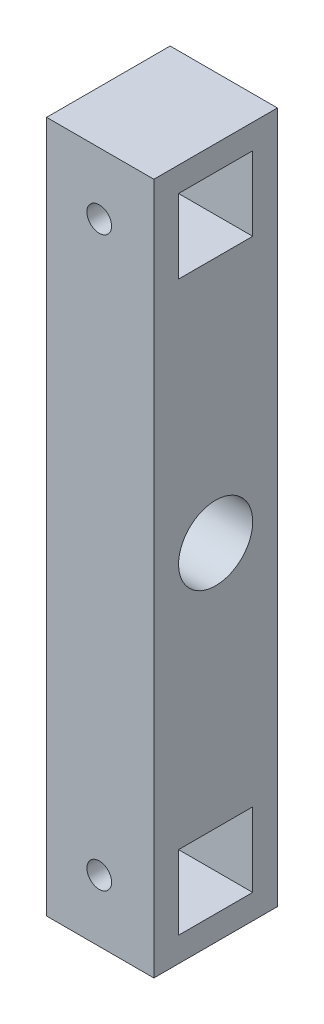
ISO-10303-21;
HEADER;
FILE_DESCRIPTION(('STEP AP214'),'2;1');
FILE_NAME('part.step','',(''),(''),'','','');
FILE_SCHEMA(('AUTOMOTIVE_DESIGN { 1 0 10303 214 1 1 1 1 }'));
ENDSEC;
DATA;
#1=APPLICATION_CONTEXT('core data for automotive mechanical design processes');
#2=APPLICATION_PROTOCOL_DEFINITION('international standard','automotive_design',2000,#1);
#3=PRODUCT_CONTEXT('',#1,'mechanical');
#4=PRODUCT('Part','Part','',(#3));
#5=PRODUCT_RELATED_PRODUCT_CATEGORY('part','',(#4));
#6=PRODUCT_DEFINITION_FORMATION('','',#4);
#7=PRODUCT_DEFINITION_CONTEXT('part definition',#1,'design');
#8=PRODUCT_DEFINITION('design','',#6,#7);
#9=PRODUCT_DEFINITION_SHAPE('','',#8);
#10=(LENGTH_UNIT() NAMED_UNIT(*) SI_UNIT(.MILLI.,.METRE.));
#11=(NAMED_UNIT(*) PLANE_ANGLE_UNIT() SI_UNIT($,.RADIAN.));
#12=(NAMED_UNIT(*) SI_UNIT($,.STERADIAN.) SOLID_ANGLE_UNIT());
#13=UNCERTAINTY_MEASURE_WITH_UNIT(LENGTH_MEASURE(1.E-05),#10,'distance_accuracy_value','');
#14=(GEOMETRIC_REPRESENTATION_CONTEXT(3) GLOBAL_UNCERTAINTY_ASSIGNED_CONTEXT((#13)) GLOBAL_UNIT_ASSIGNED_CONTEXT((#10,
#11,#12)) REPRESENTATION_CONTEXT('',''));
#15=CARTESIAN_POINT('',(0.,0.,0.));
#16=DIRECTION('',(0.,0.,1.));
#17=DIRECTION('',(1.,0.,0.));
#18=AXIS2_PLACEMENT_3D('',#15,#16,#17);
#19=CARTESIAN_POINT('',(208.703134794514,0.,50.));
#20=DIRECTION('',(-1.,0.,0.));
#21=DIRECTION('',(0.,0.,1.));
#22=AXIS2_PLACEMENT_3D('',#19,#20,#21);
#23=PLANE('',#22);
#24=CARTESIAN_POINT('',(208.703134794514,-115.,25.));
#25=DIRECTION('',(-1.,0.,0.));
#26=DIRECTION('',(0.,0.,1.));
#27=AXIS2_PLACEMENT_3D('',#24,#25,#26);
#28=CIRCLE('',#27,15.);
#29=CARTESIAN_POINT('',(208.703134794514,-115.,40.));
#30=VERTEX_POINT('',#29);
#31=EDGE_CURVE('E315',#30,#30,#28,.T.);
#32=ORIENTED_EDGE('',*,*,#31,.F.);
#33=EDGE_LOOP('',(#32));
#34=FACE_BOUND('',#33,.T.);
#35=DIRECTION('',(0.,0.,1.));
#36=VECTOR('',#35,1.);
#37=CARTESIAN_POINT('',(208.703134794514,-15.,50.));
#38=LINE('',#37,#36);
#39=CARTESIAN_POINT('',(208.703134794514,-15.,10.));
#40=VERTEX_POINT('',#39);
#41=CARTESIAN_POINT('',(208.703134794514,-15.,40.));
#42=VERTEX_POINT('',#41);
#43=EDGE_CURVE('E196',#40,#42,#38,.T.);
#44=ORIENTED_EDGE('',*,*,#43,.F.);
#45=DIRECTION('',(0.,1.,0.));
#46=VECTOR('',#45,1.);
#47=CARTESIAN_POINT('',(208.703134794514,0.,10.));
#48=LINE('',#47,#46);
#49=CARTESIAN_POINT('',(208.703134794514,15.,10.));
#50=VERTEX_POINT('',#49);
#51=EDGE_CURVE('E190',#40,#50,#48,.T.);
#52=ORIENTED_EDGE('',*,*,#51,.T.);
#53=DIRECTION('',(0.,0.,1.));
#54=VECTOR('',#53,1.);
#55=CARTESIAN_POINT('',(208.703134794514,15.,50.));
#56=LINE('',#55,#54);
#57=CARTESIAN_POINT('',(208.703134794514,15.,40.));
#58=VERTEX_POINT('',#57);
#59=EDGE_CURVE('E193',#50,#58,#56,.T.);
#60=ORIENTED_EDGE('',*,*,#59,.T.);
#61=DIRECTION('',(0.,1.,0.));
#62=VECTOR('',#61,1.);
#63=CARTESIAN_POINT('',(208.703134794514,0.,40.));
#64=LINE('',#63,#62);
#65=EDGE_CURVE('E186',#42,#58,#64,.T.);
#66=ORIENTED_EDGE('',*,*,#65,.F.);
#67=EDGE_LOOP('',(#44,#52,#60,#66));
#68=FACE_BOUND('',#67,.T.);
#69=DIRECTION('',(0.,1.,0.));
#70=VECTOR('',#69,1.);
#71=CARTESIAN_POINT('',(208.703134794514,0.,0.));
#72=LINE('',#71,#70);
#73=CARTESIAN_POINT('',(208.703134794514,-255.,0.));
#74=VERTEX_POINT('',#73);
#75=CARTESIAN_POINT('',(208.703134794514,25.,0.));
#76=VERTEX_POINT('',#75);
#77=EDGE_CURVE('E227',#74,#76,#72,.T.);
#78=ORIENTED_EDGE('',*,*,#77,.F.);
#79=DIRECTION('',(0.,0.,-1.));
#80=VECTOR('',#79,1.);
#81=CARTESIAN_POINT('',(208.703134794514,-255.,50.));
#82=LINE('',#81,#80);
#83=CARTESIAN_POINT('',(208.703134794514,-255.,50.));
#84=VERTEX_POINT('',#83);
#85=EDGE_CURVE('E45',#84,#74,#82,.T.);
#86=ORIENTED_EDGE('',*,*,#85,.F.);
#87=DIRECTION('',(0.,1.,0.));
#88=VECTOR('',#87,1.);
#89=CARTESIAN_POINT('',(208.703134794514,0.,50.));
#90=LINE('',#89,#88);
#91=CARTESIAN_POINT('',(208.703134794514,25.,50.));
#92=VERTEX_POINT('',#91);
#93=EDGE_CURVE('E214',#84,#92,#90,.T.);
#94=ORIENTED_EDGE('',*,*,#93,.T.);
#95=DIRECTION('',(0.,0.,-1.));
#96=VECTOR('',#95,1.);
#97=CARTESIAN_POINT('',(208.703134794514,25.,50.));
#98=LINE('',#97,#96);
#99=EDGE_CURVE('E11',#92,#76,#98,.T.);
#100=ORIENTED_EDGE('',*,*,#99,.T.);
#101=EDGE_LOOP('',(#78,#86,#94,#100));
#102=FACE_BOUND('',#101,.T.);
#103=DIRECTION('',(0.,0.,1.));
#104=VECTOR('',#103,1.);
#105=CARTESIAN_POINT('',(208.703134794514,-215.,50.));
#106=LINE('',#105,#104);
#107=CARTESIAN_POINT('',(208.703134794514,-215.,10.));
#108=VERTEX_POINT('',#107);
#109=CARTESIAN_POINT('',(208.703134794514,-215.,40.));
#110=VERTEX_POINT('',#109);
#111=EDGE_CURVE('E161',#108,#110,#106,.T.);
#112=ORIENTED_EDGE('',*,*,#111,.T.);
#113=DIRECTION('',(0.,-1.,0.));
#114=VECTOR('',#113,1.);
#115=CARTESIAN_POINT('',(208.703134794514,0.,39.9999999999999));
#116=LINE('',#115,#114);
#117=CARTESIAN_POINT('',(208.703134794514,-245.,40.));
#118=VERTEX_POINT('',#117);
#119=EDGE_CURVE('E156',#110,#118,#116,.T.);
#120=ORIENTED_EDGE('',*,*,#119,.T.);
#121=DIRECTION('',(0.,0.,1.));
#122=VECTOR('',#121,1.);
#123=CARTESIAN_POINT('',(208.703134794514,-245.,50.));
#124=LINE('',#123,#122);
#125=CARTESIAN_POINT('',(208.703134794514,-245.,10.));
#126=VERTEX_POINT('',#125);
#127=EDGE_CURVE('E159',#126,#118,#124,.T.);
#128=ORIENTED_EDGE('',*,*,#127,.F.);
#129=DIRECTION('',(0.,-1.,0.));
#130=VECTOR('',#129,1.);
#131=CARTESIAN_POINT('',(208.703134794514,0.,9.99999999999997));
#132=LINE('',#131,#130);
#133=EDGE_CURVE('E133',#108,#126,#132,.T.);
#134=ORIENTED_EDGE('',*,*,#133,.F.);
#135=EDGE_LOOP('',(#112,#120,#128,#134));
#136=FACE_BOUND('',#135,.T.);
#137=ADVANCED_FACE('F36',(#34,#68,#102,#136),#23,.T.);
#138=CARTESIAN_POINT('',(252.115995137388,0.,50.));
#139=DIRECTION('',(1.,0.,0.));
#140=DIRECTION('',(0.,1.,0.));
#141=AXIS2_PLACEMENT_3D('',#138,#139,#140);
#142=PLANE('',#141);
#143=CARTESIAN_POINT('',(252.115995137388,-115.,25.));
#144=DIRECTION('',(1.,0.,0.));
#145=DIRECTION('',(0.,1.,0.));
#146=AXIS2_PLACEMENT_3D('',#143,#144,#145);
#147=CIRCLE('',#146,15.);
#148=CARTESIAN_POINT('',(252.115995137388,-100.,25.));
#149=VERTEX_POINT('',#148);
#150=EDGE_CURVE('E318',#149,#149,#147,.T.);
#151=ORIENTED_EDGE('',*,*,#150,.F.);
#152=EDGE_LOOP('',(#151));
#153=FACE_BOUND('',#152,.T.);
#154=DIRECTION('',(0.,0.,-1.));
#155=VECTOR('',#154,1.);
#156=CARTESIAN_POINT('',(252.115995137388,15.,0.));
#157=LINE('',#156,#155);
#158=CARTESIAN_POINT('',(252.115995137388,15.,40.));
#159=VERTEX_POINT('',#158);
#160=CARTESIAN_POINT('',(252.115995137388,15.,10.));
#161=VERTEX_POINT('',#160);
#162=EDGE_CURVE('E167',#159,#161,#157,.T.);
#163=ORIENTED_EDGE('',*,*,#162,.T.);
#164=DIRECTION('',(0.,-1.,0.));
#165=VECTOR('',#164,1.);
#166=CARTESIAN_POINT('',(252.115995137388,0.,10.));
#167=LINE('',#166,#165);
#168=CARTESIAN_POINT('',(252.115995137388,-15.,10.));
#169=VERTEX_POINT('',#168);
#170=EDGE_CURVE('E164',#161,#169,#167,.T.);
#171=ORIENTED_EDGE('',*,*,#170,.T.);
#172=DIRECTION('',(0.,0.,-1.));
#173=VECTOR('',#172,1.);
#174=CARTESIAN_POINT('',(252.115995137388,-15.,0.));
#175=LINE('',#174,#173);
#176=CARTESIAN_POINT('',(252.115995137388,-15.,40.));
#177=VERTEX_POINT('',#176);
#178=EDGE_CURVE('E173',#177,#169,#175,.T.);
#179=ORIENTED_EDGE('',*,*,#178,.F.);
#180=DIRECTION('',(0.,-1.,0.));
#181=VECTOR('',#180,1.);
#182=CARTESIAN_POINT('',(252.115995137388,0.,40.));
#183=LINE('',#182,#181);
#184=EDGE_CURVE('E170',#159,#177,#183,.T.);
#185=ORIENTED_EDGE('',*,*,#184,.F.);
#186=EDGE_LOOP('',(#163,#171,#179,#185));
#187=FACE_BOUND('',#186,.T.);
#188=DIRECTION('',(0.,-1.,0.));
#189=VECTOR('',#188,1.);
#190=CARTESIAN_POINT('',(252.115995137388,0.,0.));
#191=LINE('',#190,#189);
#192=CARTESIAN_POINT('',(252.115995137388,25.,0.));
#193=VERTEX_POINT('',#192);
#194=CARTESIAN_POINT('',(252.115995137389,-255.,0.));
#195=VERTEX_POINT('',#194);
#196=EDGE_CURVE('E215',#193,#195,#191,.T.);
#197=ORIENTED_EDGE('',*,*,#196,.F.);
#198=DIRECTION('',(0.,0.,-1.));
#199=VECTOR('',#198,1.);
#200=CARTESIAN_POINT('',(252.115995137388,25.,50.));
#201=LINE('',#200,#199);
#202=CARTESIAN_POINT('',(252.115995137388,25.,50.));
#203=VERTEX_POINT('',#202);
#204=EDGE_CURVE('E224',#203,#193,#201,.T.);
#205=ORIENTED_EDGE('',*,*,#204,.F.);
#206=DIRECTION('',(0.,-1.,0.));
#207=VECTOR('',#206,1.);
#208=CARTESIAN_POINT('',(252.115995137388,0.,50.));
#209=LINE('',#208,#207);
#210=CARTESIAN_POINT('',(252.115995137389,-255.,50.));
#211=VERTEX_POINT('',#210);
#212=EDGE_CURVE('E221',#203,#211,#209,.T.);
#213=ORIENTED_EDGE('',*,*,#212,.T.);
#214=DIRECTION('',(0.,0.,-1.));
#215=VECTOR('',#214,1.);
#216=CARTESIAN_POINT('',(252.115995137389,-255.,50.));
#217=LINE('',#216,#215);
#218=EDGE_CURVE('E236',#211,#195,#217,.T.);
#219=ORIENTED_EDGE('',*,*,#218,.T.);
#220=EDGE_LOOP('',(#197,#205,#213,#219));
#221=FACE_BOUND('',#220,.T.);
#222=DIRECTION('',(0.,0.,-1.));
#223=VECTOR('',#222,1.);
#224=CARTESIAN_POINT('',(252.115995137388,-245.,0.));
#225=LINE('',#224,#223);
#226=CARTESIAN_POINT('',(252.115995137389,-245.,40.));
#227=VERTEX_POINT('',#226);
#228=CARTESIAN_POINT('',(252.115995137388,-245.,10.));
#229=VERTEX_POINT('',#228);
#230=EDGE_CURVE('E139',#227,#229,#225,.T.);
#231=ORIENTED_EDGE('',*,*,#230,.F.);
#232=DIRECTION('',(0.,1.,0.));
#233=VECTOR('',#232,1.);
#234=CARTESIAN_POINT('',(252.115995137388,0.,39.9999999999999));
#235=LINE('',#234,#233);
#236=CARTESIAN_POINT('',(252.115995137388,-215.,40.));
#237=VERTEX_POINT('',#236);
#238=EDGE_CURVE('E61',#227,#237,#235,.T.);
#239=ORIENTED_EDGE('',*,*,#238,.T.);
#240=DIRECTION('',(0.,0.,-1.));
#241=VECTOR('',#240,1.);
#242=CARTESIAN_POINT('',(252.115995137388,-215.,0.));
#243=LINE('',#242,#241);
#244=CARTESIAN_POINT('',(252.115995137388,-215.,10.));
#245=VERTEX_POINT('',#244);
#246=EDGE_CURVE('E145',#237,#245,#243,.T.);
#247=ORIENTED_EDGE('',*,*,#246,.T.);
#248=DIRECTION('',(0.,1.,0.));
#249=VECTOR('',#248,1.);
#250=CARTESIAN_POINT('',(252.115995137388,0.,9.99999999999997));
#251=LINE('',#250,#249);
#252=EDGE_CURVE('E130',#229,#245,#251,.T.);
#253=ORIENTED_EDGE('',*,*,#252,.F.);
#254=EDGE_LOOP('',(#231,#239,#247,#253));
#255=FACE_BOUND('',#254,.T.);
#256=ADVANCED_FACE('F143',(#153,#187,#221,#255),#142,.T.);
#257=CARTESIAN_POINT('',(230.,-230.,0.));
#258=DIRECTION('',(0.,0.,1.));
#259=DIRECTION('',(1.,0.,0.));
#260=AXIS2_PLACEMENT_3D('',#257,#258,#259);
#261=CYLINDRICAL_SURFACE('',#260,5.00000000000002);
#262=CARTESIAN_POINT('',(230.,-230.,50.));
#263=DIRECTION('',(0.,0.,1.));
#264=DIRECTION('',(1.,0.,0.));
#265=AXIS2_PLACEMENT_3D('',#262,#263,#264);
#266=CIRCLE('',#265,5.00000000000002);
#267=CARTESIAN_POINT('',(235.,-230.,50.));
#268=VERTEX_POINT('',#267);
#269=EDGE_CURVE('E198',#268,#268,#266,.T.);
#270=ORIENTED_EDGE('',*,*,#269,.T.);
#271=EDGE_LOOP('',(#270));
#272=FACE_BOUND('',#271,.T.);
#273=CARTESIAN_POINT('',(230.,-230.,40.));
#274=DIRECTION('',(0.,0.,-1.));
#275=DIRECTION('',(0.,1.,0.));
#276=AXIS2_PLACEMENT_3D('',#273,#274,#275);
#277=CIRCLE('',#276,5.00000000000002);
#278=CARTESIAN_POINT('',(230.,-225.,40.));
#279=VERTEX_POINT('',#278);
#280=EDGE_CURVE('E40',#279,#279,#277,.F.);
#281=ORIENTED_EDGE('',*,*,#280,.F.);
#282=EDGE_LOOP('',(#281));
#283=FACE_BOUND('',#282,.T.);
#284=ADVANCED_FACE('F265',(#272,#283),#261,.F.);
#285=CARTESIAN_POINT('',(230.,0.,0.));
#286=DIRECTION('',(0.,0.,1.));
#287=DIRECTION('',(1.,0.,0.));
#288=AXIS2_PLACEMENT_3D('',#285,#286,#287);
#289=CYLINDRICAL_SURFACE('',#288,5.00000000000002);
#290=CARTESIAN_POINT('',(230.,0.,0.));
#291=DIRECTION('',(0.,0.,1.));
#292=DIRECTION('',(1.,0.,0.));
#293=AXIS2_PLACEMENT_3D('',#290,#291,#292);
#294=CIRCLE('',#293,5.00000000000002);
#295=CARTESIAN_POINT('',(235.,0.,0.));
#296=VERTEX_POINT('',#295);
#297=EDGE_CURVE('E205',#296,#296,#294,.T.);
#298=ORIENTED_EDGE('',*,*,#297,.F.);
#299=EDGE_LOOP('',(#298));
#300=FACE_BOUND('',#299,.T.);
#301=CARTESIAN_POINT('',(230.,0.,10.));
#302=DIRECTION('',(0.,0.,1.));
#303=DIRECTION('',(0.,-1.,0.));
#304=AXIS2_PLACEMENT_3D('',#301,#302,#303);
#305=CIRCLE('',#304,5.00000000000002);
#306=CARTESIAN_POINT('',(230.,-5.00000000000002,10.));
#307=VERTEX_POINT('',#306);
#308=EDGE_CURVE('E189',#307,#307,#305,.F.);
#309=ORIENTED_EDGE('',*,*,#308,.F.);
#310=EDGE_LOOP('',(#309));
#311=FACE_BOUND('',#310,.T.);
#312=ADVANCED_FACE('F287',(#300,#311),#289,.F.);
#313=CARTESIAN_POINT('',(0.,25.,50.));
#314=DIRECTION('',(0.,1.,0.));
#315=DIRECTION('',(0.,0.,1.));
#316=AXIS2_PLACEMENT_3D('',#313,#314,#315);
#317=PLANE('',#316);
#318=DIRECTION('',(1.,0.,0.));
#319=VECTOR('',#318,1.);
#320=CARTESIAN_POINT('',(0.,25.,0.));
#321=LINE('',#320,#319);
#322=EDGE_CURVE('E208',#76,#193,#321,.T.);
#323=ORIENTED_EDGE('',*,*,#322,.F.);
#324=ORIENTED_EDGE('',*,*,#99,.F.);
#325=DIRECTION('',(1.,0.,0.));
#326=VECTOR('',#325,1.);
#327=CARTESIAN_POINT('',(0.,25.,50.));
#328=LINE('',#327,#326);
#329=EDGE_CURVE('E211',#92,#203,#328,.T.);
#330=ORIENTED_EDGE('',*,*,#329,.T.);
#331=ORIENTED_EDGE('',*,*,#204,.T.);
#332=EDGE_LOOP('',(#323,#324,#330,#331));
#333=FACE_BOUND('',#332,.T.);
#334=ADVANCED_FACE('F38',(#333),#317,.T.);
#335=CARTESIAN_POINT('',(0.,-255.,50.));
#336=DIRECTION('',(0.,-1.,0.));
#337=DIRECTION('',(0.,0.,-1.));
#338=AXIS2_PLACEMENT_3D('',#335,#336,#337);
#339=PLANE('',#338);
#340=DIRECTION('',(-1.,0.,0.));
#341=VECTOR('',#340,1.);
#342=CARTESIAN_POINT('',(0.,-255.,0.));
#343=LINE('',#342,#341);
#344=EDGE_CURVE('E230',#195,#74,#343,.T.);
#345=ORIENTED_EDGE('',*,*,#344,.F.);
#346=ORIENTED_EDGE('',*,*,#218,.F.);
#347=DIRECTION('',(-1.,0.,0.));
#348=VECTOR('',#347,1.);
#349=CARTESIAN_POINT('',(0.,-255.,50.));
#350=LINE('',#349,#348);
#351=EDGE_CURVE('E218',#211,#84,#350,.T.);
#352=ORIENTED_EDGE('',*,*,#351,.T.);
#353=ORIENTED_EDGE('',*,*,#85,.T.);
#354=EDGE_LOOP('',(#345,#346,#352,#353));
#355=FACE_BOUND('',#354,.T.);
#356=ADVANCED_FACE('F271',(#355),#339,.T.);
#357=CARTESIAN_POINT('',(0.,0.,50.));
#358=DIRECTION('',(0.,0.,1.));
#359=DIRECTION('',(1.,0.,0.));
#360=AXIS2_PLACEMENT_3D('',#357,#358,#359);
#361=PLANE('',#360);
#362=ORIENTED_EDGE('',*,*,#269,.F.);
#363=EDGE_LOOP('',(#362));
#364=FACE_BOUND('',#363,.T.);
#365=CARTESIAN_POINT('',(230.,0.,50.));
#366=DIRECTION('',(0.,0.,1.));
#367=DIRECTION('',(1.,0.,0.));
#368=AXIS2_PLACEMENT_3D('',#365,#366,#367);
#369=CIRCLE('',#368,5.00000000000002);
#370=CARTESIAN_POINT('',(235.,0.,50.));
#371=VERTEX_POINT('',#370);
#372=EDGE_CURVE('E202',#371,#371,#369,.T.);
#373=ORIENTED_EDGE('',*,*,#372,.F.);
#374=EDGE_LOOP('',(#373));
#375=FACE_BOUND('',#374,.T.);
#376=ORIENTED_EDGE('',*,*,#329,.F.);
#377=ORIENTED_EDGE('',*,*,#93,.F.);
#378=ORIENTED_EDGE('',*,*,#351,.F.);
#379=ORIENTED_EDGE('',*,*,#212,.F.);
#380=EDGE_LOOP('',(#376,#377,#378,#379));
#381=FACE_BOUND('',#380,.T.);
#382=ADVANCED_FACE('F273',(#364,#375,#381),#361,.T.);
#383=CARTESIAN_POINT('',(0.,0.,0.));
#384=DIRECTION('',(0.,0.,1.));
#385=DIRECTION('',(1.,0.,0.));
#386=AXIS2_PLACEMENT_3D('',#383,#384,#385);
#387=PLANE('',#386);
#388=CARTESIAN_POINT('',(230.,-230.,0.));
#389=DIRECTION('',(0.,0.,1.));
#390=DIRECTION('',(1.,0.,0.));
#391=AXIS2_PLACEMENT_3D('',#388,#389,#390);
#392=CIRCLE('',#391,5.00000000000002);
#393=CARTESIAN_POINT('',(235.,-230.,0.));
#394=VERTEX_POINT('',#393);
#395=EDGE_CURVE('E199',#394,#394,#392,.T.);
#396=ORIENTED_EDGE('',*,*,#395,.T.);
#397=EDGE_LOOP('',(#396));
#398=FACE_BOUND('',#397,.T.);
#399=ORIENTED_EDGE('',*,*,#297,.T.);
#400=EDGE_LOOP('',(#399));
#401=FACE_BOUND('',#400,.T.);
#402=ORIENTED_EDGE('',*,*,#322,.T.);
#403=ORIENTED_EDGE('',*,*,#196,.T.);
#404=ORIENTED_EDGE('',*,*,#344,.T.);
#405=ORIENTED_EDGE('',*,*,#77,.T.);
#406=EDGE_LOOP('',(#402,#403,#404,#405));
#407=FACE_BOUND('',#406,.T.);
#408=ADVANCED_FACE('F276',(#398,#401,#407),#387,.F.);
#409=CARTESIAN_POINT('',(230.,0.,40.));
#410=DIRECTION('',(0.,0.,1.));
#411=DIRECTION('',(0.,-1.,0.));
#412=AXIS2_PLACEMENT_3D('',#409,#410,#411);
#413=CIRCLE('',#412,5.00000000000002);
#414=CARTESIAN_POINT('',(230.,-5.00000000000002,40.));
#415=VERTEX_POINT('',#414);
#416=EDGE_CURVE('E179',#415,#415,#413,.F.);
#417=ORIENTED_EDGE('',*,*,#416,.T.);
#418=EDGE_LOOP('',(#417));
#419=FACE_BOUND('',#418,.T.);
#420=ORIENTED_EDGE('',*,*,#372,.T.);
#421=EDGE_LOOP('',(#420));
#422=FACE_BOUND('',#421,.T.);
#423=ADVANCED_FACE('F279',(#419,#422),#289,.F.);
#424=CARTESIAN_POINT('',(230.,-230.,10.));
#425=DIRECTION('',(0.,0.,-1.));
#426=DIRECTION('',(0.,1.,0.));
#427=AXIS2_PLACEMENT_3D('',#424,#425,#426);
#428=CIRCLE('',#427,5.00000000000002);
#429=CARTESIAN_POINT('',(230.,-225.,10.));
#430=VERTEX_POINT('',#429);
#431=EDGE_CURVE('E152',#430,#430,#428,.F.);
#432=ORIENTED_EDGE('',*,*,#431,.T.);
#433=EDGE_LOOP('',(#432));
#434=FACE_BOUND('',#433,.T.);
#435=ORIENTED_EDGE('',*,*,#395,.F.);
#436=EDGE_LOOP('',(#435));
#437=FACE_BOUND('',#436,.T.);
#438=ADVANCED_FACE('F245',(#434,#437),#261,.F.);
#439=CARTESIAN_POINT('',(202.115995137388,0.,10.));
#440=DIRECTION('',(0.,0.,1.));
#441=DIRECTION('',(0.,-1.,0.));
#442=AXIS2_PLACEMENT_3D('',#439,#440,#441);
#443=PLANE('',#442);
#444=DIRECTION('',(1.,0.,0.));
#445=VECTOR('',#444,1.);
#446=CARTESIAN_POINT('',(202.115995137388,-15.,10.));
#447=LINE('',#446,#445);
#448=EDGE_CURVE('E177',#40,#169,#447,.T.);
#449=ORIENTED_EDGE('',*,*,#448,.T.);
#450=ORIENTED_EDGE('',*,*,#170,.F.);
#451=DIRECTION('',(1.,0.,0.));
#452=VECTOR('',#451,1.);
#453=CARTESIAN_POINT('',(202.115995137388,15.,10.));
#454=LINE('',#453,#452);
#455=EDGE_CURVE('E176',#50,#161,#454,.T.);
#456=ORIENTED_EDGE('',*,*,#455,.F.);
#457=ORIENTED_EDGE('',*,*,#51,.F.);
#458=EDGE_LOOP('',(#449,#450,#456,#457));
#459=FACE_BOUND('',#458,.T.);
#460=ORIENTED_EDGE('',*,*,#308,.T.);
#461=EDGE_LOOP('',(#460));
#462=FACE_BOUND('',#461,.T.);
#463=ADVANCED_FACE('F290',(#459,#462),#443,.T.);
#464=CARTESIAN_POINT('',(202.115995137388,0.,40.));
#465=DIRECTION('',(0.,0.,1.));
#466=DIRECTION('',(0.,-1.,0.));
#467=AXIS2_PLACEMENT_3D('',#464,#465,#466);
#468=PLANE('',#467);
#469=ORIENTED_EDGE('',*,*,#65,.T.);
#470=DIRECTION('',(1.,0.,0.));
#471=VECTOR('',#470,1.);
#472=CARTESIAN_POINT('',(202.115995137388,15.,40.));
#473=LINE('',#472,#471);
#474=EDGE_CURVE('E182',#58,#159,#473,.T.);
#475=ORIENTED_EDGE('',*,*,#474,.T.);
#476=ORIENTED_EDGE('',*,*,#184,.T.);
#477=DIRECTION('',(1.,0.,0.));
#478=VECTOR('',#477,1.);
#479=CARTESIAN_POINT('',(202.115995137388,-15.,40.));
#480=LINE('',#479,#478);
#481=EDGE_CURVE('E180',#42,#177,#480,.T.);
#482=ORIENTED_EDGE('',*,*,#481,.F.);
#483=EDGE_LOOP('',(#469,#475,#476,#482));
#484=FACE_BOUND('',#483,.T.);
#485=ORIENTED_EDGE('',*,*,#416,.F.);
#486=EDGE_LOOP('',(#485));
#487=FACE_BOUND('',#486,.T.);
#488=ADVANCED_FACE('F293',(#484,#487),#468,.F.);
#489=CARTESIAN_POINT('',(202.115995137388,-15.,0.));
#490=DIRECTION('',(0.,-1.,0.));
#491=DIRECTION('',(1.,0.,0.));
#492=AXIS2_PLACEMENT_3D('',#489,#490,#491);
#493=PLANE('',#492);
#494=ORIENTED_EDGE('',*,*,#43,.T.);
#495=ORIENTED_EDGE('',*,*,#481,.T.);
#496=ORIENTED_EDGE('',*,*,#178,.T.);
#497=ORIENTED_EDGE('',*,*,#448,.F.);
#498=EDGE_LOOP('',(#494,#495,#496,#497));
#499=FACE_BOUND('',#498,.T.);
#500=ADVANCED_FACE('F297',(#499),#493,.F.);
#501=CARTESIAN_POINT('',(202.115995137388,15.,0.));
#502=DIRECTION('',(0.,-1.,0.));
#503=DIRECTION('',(1.,0.,0.));
#504=AXIS2_PLACEMENT_3D('',#501,#502,#503);
#505=PLANE('',#504);
#506=ORIENTED_EDGE('',*,*,#455,.T.);
#507=ORIENTED_EDGE('',*,*,#162,.F.);
#508=ORIENTED_EDGE('',*,*,#474,.F.);
#509=ORIENTED_EDGE('',*,*,#59,.F.);
#510=EDGE_LOOP('',(#506,#507,#508,#509));
#511=FACE_BOUND('',#510,.T.);
#512=ADVANCED_FACE('F257',(#511),#505,.T.);
#513=CARTESIAN_POINT('',(202.115995137388,0.,39.9999999999999));
#514=DIRECTION('',(0.,0.,-1.));
#515=DIRECTION('',(0.,1.,0.));
#516=AXIS2_PLACEMENT_3D('',#513,#514,#515);
#517=PLANE('',#516);
#518=DIRECTION('',(1.,0.,0.));
#519=VECTOR('',#518,1.);
#520=CARTESIAN_POINT('',(202.115995137388,-215.,40.));
#521=LINE('',#520,#519);
#522=EDGE_CURVE('E150',#110,#237,#521,.T.);
#523=ORIENTED_EDGE('',*,*,#522,.T.);
#524=ORIENTED_EDGE('',*,*,#238,.F.);
#525=DIRECTION('',(1.,0.,0.));
#526=VECTOR('',#525,1.);
#527=CARTESIAN_POINT('',(202.115995137388,-245.,40.));
#528=LINE('',#527,#526);
#529=EDGE_CURVE('E136',#118,#227,#528,.T.);
#530=ORIENTED_EDGE('',*,*,#529,.F.);
#531=ORIENTED_EDGE('',*,*,#119,.F.);
#532=EDGE_LOOP('',(#523,#524,#530,#531));
#533=FACE_BOUND('',#532,.T.);
#534=ORIENTED_EDGE('',*,*,#280,.T.);
#535=EDGE_LOOP('',(#534));
#536=FACE_BOUND('',#535,.T.);
#537=ADVANCED_FACE('F249',(#533,#536),#517,.T.);
#538=CARTESIAN_POINT('',(202.115995137388,0.,9.99999999999997));
#539=DIRECTION('',(0.,0.,-1.));
#540=DIRECTION('',(0.,1.,0.));
#541=AXIS2_PLACEMENT_3D('',#538,#539,#540);
#542=PLANE('',#541);
#543=ORIENTED_EDGE('',*,*,#133,.T.);
#544=DIRECTION('',(1.,0.,0.));
#545=VECTOR('',#544,1.);
#546=CARTESIAN_POINT('',(202.115995137388,-245.,10.));
#547=LINE('',#546,#545);
#548=EDGE_CURVE('E53',#126,#229,#547,.T.);
#549=ORIENTED_EDGE('',*,*,#548,.T.);
#550=ORIENTED_EDGE('',*,*,#252,.T.);
#551=DIRECTION('',(1.,0.,0.));
#552=VECTOR('',#551,1.);
#553=CARTESIAN_POINT('',(202.115995137388,-215.,10.));
#554=LINE('',#553,#552);
#555=EDGE_CURVE('E135',#108,#245,#554,.T.);
#556=ORIENTED_EDGE('',*,*,#555,.F.);
#557=EDGE_LOOP('',(#543,#549,#550,#556));
#558=FACE_BOUND('',#557,.T.);
#559=ORIENTED_EDGE('',*,*,#431,.F.);
#560=EDGE_LOOP('',(#559));
#561=FACE_BOUND('',#560,.T.);
#562=ADVANCED_FACE('F126',(#558,#561),#542,.F.);
#563=CARTESIAN_POINT('',(202.115995137388,-215.,0.));
#564=DIRECTION('',(0.,-1.,0.));
#565=DIRECTION('',(1.,0.,0.));
#566=AXIS2_PLACEMENT_3D('',#563,#564,#565);
#567=PLANE('',#566);
#568=ORIENTED_EDGE('',*,*,#555,.T.);
#569=ORIENTED_EDGE('',*,*,#246,.F.);
#570=ORIENTED_EDGE('',*,*,#522,.F.);
#571=ORIENTED_EDGE('',*,*,#111,.F.);
#572=EDGE_LOOP('',(#568,#569,#570,#571));
#573=FACE_BOUND('',#572,.T.);
#574=ADVANCED_FACE('F248',(#573),#567,.T.);
#575=CARTESIAN_POINT('',(202.115995137388,-245.,0.));
#576=DIRECTION('',(0.,-1.,0.));
#577=DIRECTION('',(1.,0.,0.));
#578=AXIS2_PLACEMENT_3D('',#575,#576,#577);
#579=PLANE('',#578);
#580=ORIENTED_EDGE('',*,*,#127,.T.);
#581=ORIENTED_EDGE('',*,*,#529,.T.);
#582=ORIENTED_EDGE('',*,*,#230,.T.);
#583=ORIENTED_EDGE('',*,*,#548,.F.);
#584=EDGE_LOOP('',(#580,#581,#582,#583));
#585=FACE_BOUND('',#584,.T.);
#586=ADVANCED_FACE('F140',(#585),#579,.F.);
#587=CARTESIAN_POINT('',(202.115995137388,-115.,25.));
#588=DIRECTION('',(1.,0.,0.));
#589=DIRECTION('',(0.,1.,0.));
#590=AXIS2_PLACEMENT_3D('',#587,#588,#589);
#591=CYLINDRICAL_SURFACE('',#590,15.);
#592=ORIENTED_EDGE('',*,*,#31,.T.);
#593=EDGE_LOOP('',(#592));
#594=FACE_BOUND('',#593,.T.);
#595=ORIENTED_EDGE('',*,*,#150,.T.);
#596=EDGE_LOOP('',(#595));
#597=FACE_BOUND('',#596,.T.);
#598=ADVANCED_FACE('F305',(#594,#597),#591,.F.);
#599=CLOSED_SHELL('',(#137,#256,#284,#312,#334,#356,#382,#408,#423,#438,#463,#488,#500,#512,
#537,#562,#574,#586,#598));
#600=MANIFOLD_SOLID_BREP('B2',#599);
#601=ADVANCED_BREP_SHAPE_REPRESENTATION('',(#18,#600),#14);
#602=SHAPE_DEFINITION_REPRESENTATION(#9,#601);
ENDSEC;
END-ISO-10303-21;
